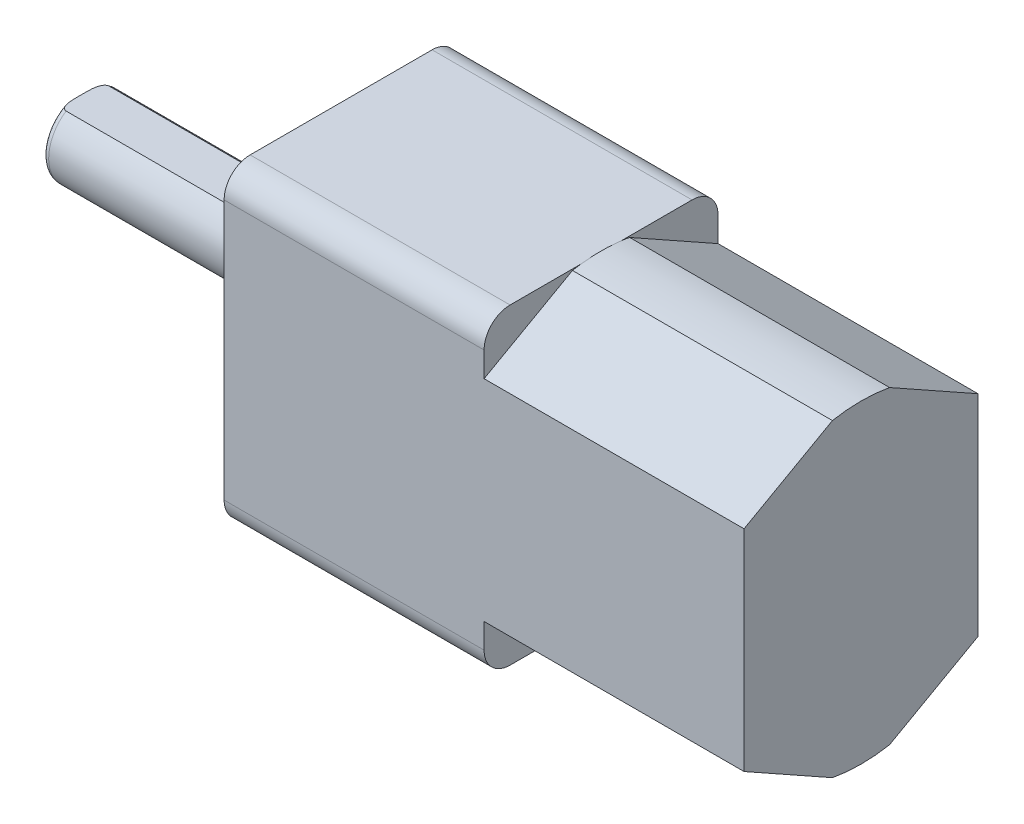
ISO-10303-21;
HEADER;
FILE_DESCRIPTION(('STEP AP214'),'2;1');
FILE_NAME('part.step','',(''),(''),'','','');
FILE_SCHEMA(('AUTOMOTIVE_DESIGN { 1 0 10303 214 1 1 1 1 }'));
ENDSEC;
DATA;
#1=APPLICATION_CONTEXT('core data for automotive mechanical design processes');
#2=APPLICATION_PROTOCOL_DEFINITION('international standard','automotive_design',2000,#1);
#3=PRODUCT_CONTEXT('',#1,'mechanical');
#4=PRODUCT('Part','Part','',(#3));
#5=PRODUCT_RELATED_PRODUCT_CATEGORY('part','',(#4));
#6=PRODUCT_DEFINITION_FORMATION('','',#4);
#7=PRODUCT_DEFINITION_CONTEXT('part definition',#1,'design');
#8=PRODUCT_DEFINITION('design','',#6,#7);
#9=PRODUCT_DEFINITION_SHAPE('','',#8);
#10=(LENGTH_UNIT() NAMED_UNIT(*) SI_UNIT(.MILLI.,.METRE.));
#11=(NAMED_UNIT(*) PLANE_ANGLE_UNIT() SI_UNIT($,.RADIAN.));
#12=(NAMED_UNIT(*) SI_UNIT($,.STERADIAN.) SOLID_ANGLE_UNIT());
#13=UNCERTAINTY_MEASURE_WITH_UNIT(LENGTH_MEASURE(1.E-05),#10,'distance_accuracy_value','');
#14=(GEOMETRIC_REPRESENTATION_CONTEXT(3) GLOBAL_UNCERTAINTY_ASSIGNED_CONTEXT((#13)) GLOBAL_UNIT_ASSIGNED_CONTEXT((#10,
#11,#12)) REPRESENTATION_CONTEXT('',''));
#15=CARTESIAN_POINT('',(0.,0.,0.));
#16=DIRECTION('',(0.,0.,1.));
#17=DIRECTION('',(1.,0.,0.));
#18=AXIS2_PLACEMENT_3D('',#15,#16,#17);
#19=CARTESIAN_POINT('',(-5.7,0.,0.));
#20=DIRECTION('',(-1.,0.,0.));
#21=DIRECTION('',(0.,0.,1.));
#22=AXIS2_PLACEMENT_3D('',#19,#20,#21);
#23=PLANE('',#22);
#24=CARTESIAN_POINT('',(-5.7,0.,-4.5));
#25=DIRECTION('',(-1.,0.,0.));
#26=DIRECTION('',(0.,0.,1.));
#27=AXIS2_PLACEMENT_3D('',#24,#25,#26);
#28=CIRCLE('',#27,2.);
#29=CARTESIAN_POINT('',(-5.7,0.,-2.5));
#30=VERTEX_POINT('',#29);
#31=EDGE_CURVE('E550',#30,#30,#28,.T.);
#32=ORIENTED_EDGE('',*,*,#31,.T.);
#33=EDGE_LOOP('',(#32));
#34=FACE_BOUND('',#33,.T.);
#35=DIRECTION('',(0.,0.,-1.));
#36=VECTOR('',#35,1.);
#37=CARTESIAN_POINT('',(-5.7,1.25,0.));
#38=LINE('',#37,#36);
#39=CARTESIAN_POINT('',(-5.7,1.25,-3.67084380241115));
#40=VERTEX_POINT('',#39);
#41=CARTESIAN_POINT('',(-5.7,1.25,-5.32915619758885));
#42=VERTEX_POINT('',#41);
#43=EDGE_CURVE('E274',#40,#42,#38,.T.);
#44=ORIENTED_EDGE('',*,*,#43,.F.);
#45=CARTESIAN_POINT('',(-5.7,0.,-4.5));
#46=DIRECTION('',(-1.,0.,0.));
#47=DIRECTION('',(0.,0.,1.));
#48=AXIS2_PLACEMENT_3D('',#45,#46,#47);
#49=CIRCLE('',#48,1.5);
#50=EDGE_CURVE('E279',#40,#42,#49,.F.);
#51=ORIENTED_EDGE('',*,*,#50,.T.);
#52=EDGE_LOOP('',(#44,#51));
#53=FACE_BOUND('',#52,.T.);
#54=ADVANCED_FACE('F133',(#34,#53),#23,.T.);
#55=CARTESIAN_POINT('',(5.,0.,-9.));
#56=DIRECTION('',(1.,0.,0.));
#57=DIRECTION('',(0.,0.,-1.));
#58=AXIS2_PLACEMENT_3D('',#55,#56,#57);
#59=PLANE('',#58);
#60=DIRECTION('',(0.,0.,1.));
#61=VECTOR('',#60,1.);
#62=CARTESIAN_POINT('',(5.,-6.,-9.));
#63=LINE('',#62,#61);
#64=CARTESIAN_POINT('',(5.,-6.,-8.));
#65=VERTEX_POINT('',#64);
#66=CARTESIAN_POINT('',(5.,-6.,-5.276208734813));
#67=VERTEX_POINT('',#66);
#68=EDGE_CURVE('E471',#65,#67,#63,.T.);
#69=ORIENTED_EDGE('',*,*,#68,.F.);
#70=CARTESIAN_POINT('',(5.,-5.,-8.));
#71=DIRECTION('',(1.,0.,0.));
#72=DIRECTION('',(0.,0.,-1.));
#73=AXIS2_PLACEMENT_3D('',#70,#71,#72);
#74=CIRCLE('',#73,1.);
#75=CARTESIAN_POINT('',(5.,-5.,-9.));
#76=VERTEX_POINT('',#75);
#77=EDGE_CURVE('E318',#65,#76,#74,.T.);
#78=ORIENTED_EDGE('',*,*,#77,.T.);
#79=DIRECTION('',(0.,1.,0.));
#80=VECTOR('',#79,1.);
#81=CARTESIAN_POINT('',(5.,0.,-9.));
#82=LINE('',#81,#80);
#83=CARTESIAN_POINT('',(5.,-4.04382244911915,-9.));
#84=VERTEX_POINT('',#83);
#85=EDGE_CURVE('E465',#76,#84,#82,.T.);
#86=ORIENTED_EDGE('',*,*,#85,.T.);
#87=DIRECTION('',(0.,-0.488864524341019,0.872359717571157));
#88=VECTOR('',#87,1.);
#89=CARTESIAN_POINT('',(5.,-6.91558675954847,-3.87544835421627));
#90=LINE('',#89,#88);
#91=CARTESIAN_POINT('',(5.,-5.94915960451558,-5.6));
#92=VERTEX_POINT('',#91);
#93=EDGE_CURVE('E521',#84,#92,#90,.T.);
#94=ORIENTED_EDGE('',*,*,#93,.T.);
#95=CARTESIAN_POINT('',(5.,0.,-4.5));
#96=DIRECTION('',(1.,0.,0.));
#97=DIRECTION('',(0.,0.,-1.));
#98=AXIS2_PLACEMENT_3D('',#95,#96,#97);
#99=CIRCLE('',#98,6.05);
#100=EDGE_CURVE('E512',#67,#92,#99,.T.);
#101=ORIENTED_EDGE('',*,*,#100,.F.);
#102=EDGE_LOOP('',(#69,#78,#86,#94,#101));
#103=FACE_BOUND('',#102,.T.);
#104=ADVANCED_FACE('F365',(#103),#59,.T.);
#105=DIRECTION('',(0.,1.,0.));
#106=VECTOR('',#105,1.);
#107=CARTESIAN_POINT('',(5.,0.,0.));
#108=LINE('',#107,#106);
#109=CARTESIAN_POINT('',(5.,-5.,0.));
#110=VERTEX_POINT('',#109);
#111=CARTESIAN_POINT('',(5.,-4.04382244911915,0.));
#112=VERTEX_POINT('',#111);
#113=EDGE_CURVE('E476',#110,#112,#108,.T.);
#114=ORIENTED_EDGE('',*,*,#113,.F.);
#115=CARTESIAN_POINT('',(5.,-5.,-1.));
#116=DIRECTION('',(1.,0.,0.));
#117=DIRECTION('',(0.,0.,-1.));
#118=AXIS2_PLACEMENT_3D('',#115,#116,#117);
#119=CIRCLE('',#118,1.);
#120=CARTESIAN_POINT('',(5.,-6.,-0.999999999999999));
#121=VERTEX_POINT('',#120);
#122=EDGE_CURVE('E296',#110,#121,#119,.T.);
#123=ORIENTED_EDGE('',*,*,#122,.T.);
#124=CARTESIAN_POINT('',(5.,-6.,-3.72379126518699));
#125=VERTEX_POINT('',#124);
#126=EDGE_CURVE('E464',#125,#121,#63,.T.);
#127=ORIENTED_EDGE('',*,*,#126,.F.);
#128=CARTESIAN_POINT('',(5.,-5.94915960451558,-3.4));
#129=VERTEX_POINT('',#128);
#130=EDGE_CURVE('E509',#129,#125,#99,.T.);
#131=ORIENTED_EDGE('',*,*,#130,.F.);
#132=DIRECTION('',(0.,-0.488864524341019,-0.872359717571157));
#133=VECTOR('',#132,1.);
#134=CARTESIAN_POINT('',(5.,-3.07739529408627,1.72455164578373));
#135=LINE('',#134,#133);
#136=EDGE_CURVE('E510',#112,#129,#135,.T.);
#137=ORIENTED_EDGE('',*,*,#136,.F.);
#138=EDGE_LOOP('',(#114,#123,#127,#131,#137));
#139=FACE_BOUND('',#138,.T.);
#140=ADVANCED_FACE('F687',(#139),#59,.T.);
#141=DIRECTION('',(0.,0.,1.));
#142=VECTOR('',#141,1.);
#143=CARTESIAN_POINT('',(5.,6.,-9.));
#144=LINE('',#143,#142);
#145=CARTESIAN_POINT('',(5.,6.,-3.72379126518699));
#146=VERTEX_POINT('',#145);
#147=CARTESIAN_POINT('',(5.,6.,-0.999999999999999));
#148=VERTEX_POINT('',#147);
#149=EDGE_CURVE('E493',#146,#148,#144,.T.);
#150=ORIENTED_EDGE('',*,*,#149,.T.);
#151=CARTESIAN_POINT('',(5.,5.,-0.999999999999999));
#152=DIRECTION('',(1.,0.,0.));
#153=DIRECTION('',(0.,0.,-1.));
#154=AXIS2_PLACEMENT_3D('',#151,#152,#153);
#155=CIRCLE('',#154,1.);
#156=CARTESIAN_POINT('',(5.,5.,0.));
#157=VERTEX_POINT('',#156);
#158=EDGE_CURVE('E335',#148,#157,#155,.T.);
#159=ORIENTED_EDGE('',*,*,#158,.T.);
#160=CARTESIAN_POINT('',(5.,4.04382244911915,0.));
#161=VERTEX_POINT('',#160);
#162=EDGE_CURVE('E480',#161,#157,#108,.T.);
#163=ORIENTED_EDGE('',*,*,#162,.F.);
#164=DIRECTION('',(0.,0.488864524341019,-0.872359717571157));
#165=VECTOR('',#164,1.);
#166=CARTESIAN_POINT('',(5.,3.07739529408627,1.72455164578373));
#167=LINE('',#166,#165);
#168=CARTESIAN_POINT('',(5.,5.94915960451558,-3.4));
#169=VERTEX_POINT('',#168);
#170=EDGE_CURVE('E544',#161,#169,#167,.T.);
#171=ORIENTED_EDGE('',*,*,#170,.T.);
#172=CARTESIAN_POINT('',(5.,0.,-4.5));
#173=DIRECTION('',(1.,0.,0.));
#174=DIRECTION('',(0.,0.,-1.));
#175=AXIS2_PLACEMENT_3D('',#172,#173,#174);
#176=CIRCLE('',#175,6.05);
#177=EDGE_CURVE('E487',#146,#169,#176,.T.);
#178=ORIENTED_EDGE('',*,*,#177,.F.);
#179=EDGE_LOOP('',(#150,#159,#163,#171,#178));
#180=FACE_BOUND('',#179,.T.);
#181=ADVANCED_FACE('F407',(#180),#59,.T.);
#182=CARTESIAN_POINT('',(0.,0.,-9.));
#183=DIRECTION('',(0.,0.,1.));
#184=DIRECTION('',(1.,0.,0.));
#185=AXIS2_PLACEMENT_3D('',#182,#183,#184);
#186=PLANE('',#185);
#187=ORIENTED_EDGE('',*,*,#85,.F.);
#188=DIRECTION('',(1.,0.,0.));
#189=VECTOR('',#188,1.);
#190=CARTESIAN_POINT('',(-5.,-5.,-9.));
#191=LINE('',#190,#189);
#192=CARTESIAN_POINT('',(-5.,-5.,-9.));
#193=VERTEX_POINT('',#192);
#194=EDGE_CURVE('E325',#76,#193,#191,.F.);
#195=ORIENTED_EDGE('',*,*,#194,.T.);
#196=DIRECTION('',(0.,1.,0.));
#197=VECTOR('',#196,1.);
#198=CARTESIAN_POINT('',(-5.,0.,-9.));
#199=LINE('',#198,#197);
#200=CARTESIAN_POINT('',(-5.,5.,-9.));
#201=VERTEX_POINT('',#200);
#202=EDGE_CURVE('E455',#193,#201,#199,.T.);
#203=ORIENTED_EDGE('',*,*,#202,.T.);
#204=DIRECTION('',(1.,0.,0.));
#205=VECTOR('',#204,1.);
#206=CARTESIAN_POINT('',(0.,5.,-9.));
#207=LINE('',#206,#205);
#208=CARTESIAN_POINT('',(5.,5.,-9.));
#209=VERTEX_POINT('',#208);
#210=EDGE_CURVE('E321',#201,#209,#207,.T.);
#211=ORIENTED_EDGE('',*,*,#210,.T.);
#212=CARTESIAN_POINT('',(5.,4.04382244911915,-9.));
#213=VERTEX_POINT('',#212);
#214=EDGE_CURVE('E472',#213,#209,#82,.T.);
#215=ORIENTED_EDGE('',*,*,#214,.F.);
#216=DIRECTION('',(-1.,0.,0.));
#217=VECTOR('',#216,1.);
#218=CARTESIAN_POINT('',(15.,4.04382244911915,-9.));
#219=LINE('',#218,#217);
#220=CARTESIAN_POINT('',(15.,4.04382244911915,-9.));
#221=VERTEX_POINT('',#220);
#222=EDGE_CURVE('E560',#221,#213,#219,.T.);
#223=ORIENTED_EDGE('',*,*,#222,.F.);
#224=DIRECTION('',(0.,1.,0.));
#225=VECTOR('',#224,1.);
#226=CARTESIAN_POINT('',(15.,0.,-9.));
#227=LINE('',#226,#225);
#228=CARTESIAN_POINT('',(15.,-4.04382244911915,-9.));
#229=VERTEX_POINT('',#228);
#230=EDGE_CURVE('E557',#229,#221,#227,.T.);
#231=ORIENTED_EDGE('',*,*,#230,.F.);
#232=DIRECTION('',(-1.,0.,0.));
#233=VECTOR('',#232,1.);
#234=CARTESIAN_POINT('',(15.,-4.04382244911915,-9.));
#235=LINE('',#234,#233);
#236=EDGE_CURVE('E612',#229,#84,#235,.T.);
#237=ORIENTED_EDGE('',*,*,#236,.T.);
#238=EDGE_LOOP('',(#187,#195,#203,#211,#215,#223,#231,#237));
#239=FACE_BOUND('',#238,.T.);
#240=ADVANCED_FACE('F403',(#239),#186,.F.);
#241=CARTESIAN_POINT('',(0.,0.,0.));
#242=DIRECTION('',(0.,0.,1.));
#243=DIRECTION('',(1.,0.,0.));
#244=AXIS2_PLACEMENT_3D('',#241,#242,#243);
#245=PLANE('',#244);
#246=DIRECTION('',(0.,1.,0.));
#247=VECTOR('',#246,1.);
#248=CARTESIAN_POINT('',(-5.,0.,0.));
#249=LINE('',#248,#247);
#250=CARTESIAN_POINT('',(-5.,-5.,0.));
#251=VERTEX_POINT('',#250);
#252=CARTESIAN_POINT('',(-5.,5.,0.));
#253=VERTEX_POINT('',#252);
#254=EDGE_CURVE('E479',#251,#253,#249,.T.);
#255=ORIENTED_EDGE('',*,*,#254,.F.);
#256=DIRECTION('',(1.,0.,0.));
#257=VECTOR('',#256,1.);
#258=CARTESIAN_POINT('',(0.,-5.,0.));
#259=LINE('',#258,#257);
#260=EDGE_CURVE('E289',#251,#110,#259,.T.);
#261=ORIENTED_EDGE('',*,*,#260,.T.);
#262=ORIENTED_EDGE('',*,*,#113,.T.);
#263=DIRECTION('',(-1.,0.,0.));
#264=VECTOR('',#263,1.);
#265=CARTESIAN_POINT('',(15.,-4.04382244911915,0.));
#266=LINE('',#265,#264);
#267=CARTESIAN_POINT('',(15.,-4.04382244911915,0.));
#268=VERTEX_POINT('',#267);
#269=EDGE_CURVE('E603',#268,#112,#266,.T.);
#270=ORIENTED_EDGE('',*,*,#269,.F.);
#271=DIRECTION('',(0.,-1.,0.));
#272=VECTOR('',#271,1.);
#273=CARTESIAN_POINT('',(15.,0.,0.));
#274=LINE('',#273,#272);
#275=CARTESIAN_POINT('',(15.,4.04382244911915,0.));
#276=VERTEX_POINT('',#275);
#277=EDGE_CURVE('E571',#276,#268,#274,.T.);
#278=ORIENTED_EDGE('',*,*,#277,.F.);
#279=DIRECTION('',(-1.,0.,0.));
#280=VECTOR('',#279,1.);
#281=CARTESIAN_POINT('',(15.,4.04382244911915,0.));
#282=LINE('',#281,#280);
#283=EDGE_CURVE('E597',#276,#161,#282,.T.);
#284=ORIENTED_EDGE('',*,*,#283,.T.);
#285=ORIENTED_EDGE('',*,*,#162,.T.);
#286=DIRECTION('',(1.,0.,0.));
#287=VECTOR('',#286,1.);
#288=CARTESIAN_POINT('',(-5.,5.,0.));
#289=LINE('',#288,#287);
#290=EDGE_CURVE('E286',#157,#253,#289,.F.);
#291=ORIENTED_EDGE('',*,*,#290,.T.);
#292=EDGE_LOOP('',(#255,#261,#262,#270,#278,#284,#285,#291));
#293=FACE_BOUND('',#292,.T.);
#294=ADVANCED_FACE('F406',(#293),#245,.T.);
#295=CARTESIAN_POINT('',(-5.,0.,-9.));
#296=DIRECTION('',(1.,0.,0.));
#297=DIRECTION('',(0.,0.,-1.));
#298=AXIS2_PLACEMENT_3D('',#295,#296,#297);
#299=PLANE('',#298);
#300=CARTESIAN_POINT('',(-5.,0.,-4.5));
#301=DIRECTION('',(-1.,0.,0.));
#302=DIRECTION('',(0.,0.,1.));
#303=AXIS2_PLACEMENT_3D('',#300,#301,#302);
#304=CIRCLE('',#303,2.);
#305=CARTESIAN_POINT('',(-5.,0.,-2.5));
#306=VERTEX_POINT('',#305);
#307=EDGE_CURVE('E283',#306,#306,#304,.T.);
#308=ORIENTED_EDGE('',*,*,#307,.F.);
#309=EDGE_LOOP('',(#308));
#310=FACE_BOUND('',#309,.T.);
#311=DIRECTION('',(0.,0.,1.));
#312=VECTOR('',#311,1.);
#313=CARTESIAN_POINT('',(-5.,-6.,-9.));
#314=LINE('',#313,#312);
#315=CARTESIAN_POINT('',(-5.,-6.,-8.));
#316=VERTEX_POINT('',#315);
#317=CARTESIAN_POINT('',(-5.,-6.,-0.999999999999999));
#318=VERTEX_POINT('',#317);
#319=EDGE_CURVE('E484',#316,#318,#314,.T.);
#320=ORIENTED_EDGE('',*,*,#319,.T.);
#321=CARTESIAN_POINT('',(-5.,-5.,-1.));
#322=DIRECTION('',(1.,0.,0.));
#323=DIRECTION('',(0.,0.,-1.));
#324=AXIS2_PLACEMENT_3D('',#321,#322,#323);
#325=CIRCLE('',#324,1.);
#326=EDGE_CURVE('E315',#318,#251,#325,.F.);
#327=ORIENTED_EDGE('',*,*,#326,.T.);
#328=ORIENTED_EDGE('',*,*,#254,.T.);
#329=CARTESIAN_POINT('',(-5.,5.,-0.999999999999999));
#330=DIRECTION('',(1.,0.,0.));
#331=DIRECTION('',(0.,0.,-1.));
#332=AXIS2_PLACEMENT_3D('',#329,#330,#331);
#333=CIRCLE('',#332,1.);
#334=CARTESIAN_POINT('',(-5.,6.,-0.999999999999999));
#335=VERTEX_POINT('',#334);
#336=EDGE_CURVE('E309',#253,#335,#333,.F.);
#337=ORIENTED_EDGE('',*,*,#336,.T.);
#338=DIRECTION('',(0.,0.,1.));
#339=VECTOR('',#338,1.);
#340=CARTESIAN_POINT('',(-5.,6.,-9.));
#341=LINE('',#340,#339);
#342=CARTESIAN_POINT('',(-5.,6.,-8.));
#343=VERTEX_POINT('',#342);
#344=EDGE_CURVE('E458',#343,#335,#341,.T.);
#345=ORIENTED_EDGE('',*,*,#344,.F.);
#346=CARTESIAN_POINT('',(-5.,5.,-8.));
#347=DIRECTION('',(1.,0.,0.));
#348=DIRECTION('',(0.,0.,-1.));
#349=AXIS2_PLACEMENT_3D('',#346,#347,#348);
#350=CIRCLE('',#349,1.);
#351=EDGE_CURVE('E306',#343,#201,#350,.F.);
#352=ORIENTED_EDGE('',*,*,#351,.T.);
#353=ORIENTED_EDGE('',*,*,#202,.F.);
#354=CARTESIAN_POINT('',(-5.,-5.,-8.));
#355=DIRECTION('',(1.,0.,0.));
#356=DIRECTION('',(0.,0.,-1.));
#357=AXIS2_PLACEMENT_3D('',#354,#355,#356);
#358=CIRCLE('',#357,1.);
#359=EDGE_CURVE('E312',#193,#316,#358,.F.);
#360=ORIENTED_EDGE('',*,*,#359,.T.);
#361=EDGE_LOOP('',(#320,#327,#328,#337,#345,#352,#353,#360));
#362=FACE_BOUND('',#361,.T.);
#363=ADVANCED_FACE('F412',(#310,#362),#299,.F.);
#364=CARTESIAN_POINT('',(0.,6.,-9.));
#365=DIRECTION('',(0.,-1.,0.));
#366=DIRECTION('',(0.,0.,-1.));
#367=AXIS2_PLACEMENT_3D('',#364,#365,#366);
#368=PLANE('',#367);
#369=ORIENTED_EDGE('',*,*,#344,.T.);
#370=DIRECTION('',(1.,0.,0.));
#371=VECTOR('',#370,1.);
#372=CARTESIAN_POINT('',(5.,6.,-0.999999999999999));
#373=LINE('',#372,#371);
#374=EDGE_CURVE('E331',#335,#148,#373,.T.);
#375=ORIENTED_EDGE('',*,*,#374,.T.);
#376=ORIENTED_EDGE('',*,*,#149,.F.);
#377=CARTESIAN_POINT('',(5.,6.,-5.276208734813));
#378=VERTEX_POINT('',#377);
#379=EDGE_CURVE('E492',#378,#146,#144,.T.);
#380=ORIENTED_EDGE('',*,*,#379,.F.);
#381=CARTESIAN_POINT('',(5.,6.,-8.));
#382=VERTEX_POINT('',#381);
#383=EDGE_CURVE('E490',#382,#378,#144,.T.);
#384=ORIENTED_EDGE('',*,*,#383,.F.);
#385=DIRECTION('',(1.,0.,0.));
#386=VECTOR('',#385,1.);
#387=CARTESIAN_POINT('',(0.,6.,-8.));
#388=LINE('',#387,#386);
#389=EDGE_CURVE('E328',#382,#343,#388,.F.);
#390=ORIENTED_EDGE('',*,*,#389,.T.);
#391=EDGE_LOOP('',(#369,#375,#376,#380,#384,#390));
#392=FACE_BOUND('',#391,.T.);
#393=ADVANCED_FACE('F416',(#392),#368,.F.);
#394=ORIENTED_EDGE('',*,*,#214,.T.);
#395=CARTESIAN_POINT('',(5.,5.,-8.));
#396=DIRECTION('',(1.,0.,0.));
#397=DIRECTION('',(0.,0.,-1.));
#398=AXIS2_PLACEMENT_3D('',#395,#396,#397);
#399=CIRCLE('',#398,1.);
#400=EDGE_CURVE('E338',#209,#382,#399,.T.);
#401=ORIENTED_EDGE('',*,*,#400,.T.);
#402=ORIENTED_EDGE('',*,*,#383,.T.);
#403=CARTESIAN_POINT('',(5.,5.94915960451558,-5.6));
#404=VERTEX_POINT('',#403);
#405=EDGE_CURVE('E535',#404,#378,#176,.T.);
#406=ORIENTED_EDGE('',*,*,#405,.F.);
#407=DIRECTION('',(0.,0.488864524341019,0.872359717571157));
#408=VECTOR('',#407,1.);
#409=CARTESIAN_POINT('',(5.,6.91558675954847,-3.87544835421627));
#410=LINE('',#409,#408);
#411=EDGE_CURVE('E546',#213,#404,#410,.T.);
#412=ORIENTED_EDGE('',*,*,#411,.F.);
#413=EDGE_LOOP('',(#394,#401,#402,#406,#412));
#414=FACE_BOUND('',#413,.T.);
#415=ADVANCED_FACE('F420',(#414),#59,.T.);
#416=CARTESIAN_POINT('',(0.,-6.,-9.));
#417=DIRECTION('',(0.,-1.,0.));
#418=DIRECTION('',(0.,0.,-1.));
#419=AXIS2_PLACEMENT_3D('',#416,#417,#418);
#420=PLANE('',#419);
#421=ORIENTED_EDGE('',*,*,#126,.T.);
#422=DIRECTION('',(1.,0.,0.));
#423=VECTOR('',#422,1.);
#424=CARTESIAN_POINT('',(0.,-6.,-0.999999999999999));
#425=LINE('',#424,#423);
#426=EDGE_CURVE('E303',#121,#318,#425,.F.);
#427=ORIENTED_EDGE('',*,*,#426,.T.);
#428=ORIENTED_EDGE('',*,*,#319,.F.);
#429=DIRECTION('',(1.,0.,0.));
#430=VECTOR('',#429,1.);
#431=CARTESIAN_POINT('',(5.,-6.,-8.));
#432=LINE('',#431,#430);
#433=EDGE_CURVE('E299',#316,#65,#432,.T.);
#434=ORIENTED_EDGE('',*,*,#433,.T.);
#435=ORIENTED_EDGE('',*,*,#68,.T.);
#436=EDGE_CURVE('E470',#67,#125,#63,.T.);
#437=ORIENTED_EDGE('',*,*,#436,.T.);
#438=EDGE_LOOP('',(#421,#427,#428,#434,#435,#437));
#439=FACE_BOUND('',#438,.T.);
#440=ADVANCED_FACE('F409',(#439),#420,.T.);
#441=CARTESIAN_POINT('',(5.,0.,0.));
#442=DIRECTION('',(1.,0.,0.));
#443=DIRECTION('',(0.,0.,-1.));
#444=AXIS2_PLACEMENT_3D('',#441,#442,#443);
#445=PLANE('',#444);
#446=EDGE_CURVE('E536',#378,#146,#176,.T.);
#447=ORIENTED_EDGE('',*,*,#446,.F.);
#448=ORIENTED_EDGE('',*,*,#379,.T.);
#449=EDGE_LOOP('',(#447,#448));
#450=FACE_BOUND('',#449,.T.);
#451=ADVANCED_FACE('F379',(#450),#445,.F.);
#452=CARTESIAN_POINT('',(15.,6.91558675954847,-3.87544835421627));
#453=DIRECTION('',(0.,-0.872359717571157,0.488864524341019));
#454=DIRECTION('',(0.,-0.488864524341019,-0.872359717571157));
#455=AXIS2_PLACEMENT_3D('',#452,#453,#454);
#456=PLANE('',#455);
#457=ORIENTED_EDGE('',*,*,#411,.T.);
#458=DIRECTION('',(-1.,0.,0.));
#459=VECTOR('',#458,1.);
#460=CARTESIAN_POINT('',(15.,5.94915960451558,-5.6));
#461=LINE('',#460,#459);
#462=CARTESIAN_POINT('',(15.,5.94915960451558,-5.6));
#463=VERTEX_POINT('',#462);
#464=EDGE_CURVE('E591',#463,#404,#461,.T.);
#465=ORIENTED_EDGE('',*,*,#464,.F.);
#466=DIRECTION('',(0.,0.488864524341019,0.872359717571157));
#467=VECTOR('',#466,1.);
#468=CARTESIAN_POINT('',(15.,6.91558675954847,-3.87544835421627));
#469=LINE('',#468,#467);
#470=EDGE_CURVE('E523',#221,#463,#469,.T.);
#471=ORIENTED_EDGE('',*,*,#470,.F.);
#472=ORIENTED_EDGE('',*,*,#222,.T.);
#473=EDGE_LOOP('',(#457,#465,#471,#472));
#474=FACE_BOUND('',#473,.T.);
#475=ADVANCED_FACE('F398',(#474),#456,.F.);
#476=CARTESIAN_POINT('',(15.,0.,-4.5));
#477=DIRECTION('',(-1.,0.,0.));
#478=DIRECTION('',(0.,0.,1.));
#479=AXIS2_PLACEMENT_3D('',#476,#477,#478);
#480=CYLINDRICAL_SURFACE('',#479,6.05);
#481=ORIENTED_EDGE('',*,*,#405,.T.);
#482=ORIENTED_EDGE('',*,*,#446,.T.);
#483=ORIENTED_EDGE('',*,*,#177,.T.);
#484=DIRECTION('',(-1.,0.,0.));
#485=VECTOR('',#484,1.);
#486=CARTESIAN_POINT('',(15.,5.94915960451558,-3.4));
#487=LINE('',#486,#485);
#488=CARTESIAN_POINT('',(15.,5.94915960451558,-3.4));
#489=VERTEX_POINT('',#488);
#490=EDGE_CURVE('E593',#489,#169,#487,.T.);
#491=ORIENTED_EDGE('',*,*,#490,.F.);
#492=CARTESIAN_POINT('',(15.,0.,-4.5));
#493=DIRECTION('',(1.,0.,0.));
#494=DIRECTION('',(0.,0.,-1.));
#495=AXIS2_PLACEMENT_3D('',#492,#493,#494);
#496=CIRCLE('',#495,6.05);
#497=EDGE_CURVE('E578',#463,#489,#496,.T.);
#498=ORIENTED_EDGE('',*,*,#497,.F.);
#499=ORIENTED_EDGE('',*,*,#464,.T.);
#500=EDGE_LOOP('',(#481,#482,#483,#491,#498,#499));
#501=FACE_BOUND('',#500,.T.);
#502=ADVANCED_FACE('F394',(#501),#480,.T.);
#503=CARTESIAN_POINT('',(15.,3.07739529408627,1.72455164578373));
#504=DIRECTION('',(0.,0.872359717571157,0.488864524341019));
#505=DIRECTION('',(0.,-0.488864524341019,0.872359717571157));
#506=AXIS2_PLACEMENT_3D('',#503,#504,#505);
#507=PLANE('',#506);
#508=ORIENTED_EDGE('',*,*,#170,.F.);
#509=ORIENTED_EDGE('',*,*,#283,.F.);
#510=DIRECTION('',(0.,0.488864524341019,-0.872359717571157));
#511=VECTOR('',#510,1.);
#512=CARTESIAN_POINT('',(15.,3.07739529408627,1.72455164578373));
#513=LINE('',#512,#511);
#514=EDGE_CURVE('E574',#276,#489,#513,.T.);
#515=ORIENTED_EDGE('',*,*,#514,.T.);
#516=ORIENTED_EDGE('',*,*,#490,.T.);
#517=EDGE_LOOP('',(#508,#509,#515,#516));
#518=FACE_BOUND('',#517,.T.);
#519=ADVANCED_FACE('F390',(#518),#507,.T.);
#520=CARTESIAN_POINT('',(15.,-3.07739529408627,1.72455164578373));
#521=DIRECTION('',(0.,0.872359717571157,-0.488864524341019));
#522=DIRECTION('',(0.,0.488864524341019,0.872359717571157));
#523=AXIS2_PLACEMENT_3D('',#520,#521,#522);
#524=PLANE('',#523);
#525=ORIENTED_EDGE('',*,*,#136,.T.);
#526=DIRECTION('',(-1.,0.,0.));
#527=VECTOR('',#526,1.);
#528=CARTESIAN_POINT('',(15.,-5.94915960451558,-3.4));
#529=LINE('',#528,#527);
#530=CARTESIAN_POINT('',(15.,-5.94915960451558,-3.4));
#531=VERTEX_POINT('',#530);
#532=EDGE_CURVE('E516',#531,#129,#529,.T.);
#533=ORIENTED_EDGE('',*,*,#532,.F.);
#534=DIRECTION('',(0.,-0.488864524341019,-0.872359717571157));
#535=VECTOR('',#534,1.);
#536=CARTESIAN_POINT('',(15.,-3.07739529408627,1.72455164578373));
#537=LINE('',#536,#535);
#538=EDGE_CURVE('E568',#268,#531,#537,.T.);
#539=ORIENTED_EDGE('',*,*,#538,.F.);
#540=ORIENTED_EDGE('',*,*,#269,.T.);
#541=EDGE_LOOP('',(#525,#533,#539,#540));
#542=FACE_BOUND('',#541,.T.);
#543=ADVANCED_FACE('F386',(#542),#524,.F.);
#544=CARTESIAN_POINT('',(15.,0.,-4.5));
#545=DIRECTION('',(-1.,0.,0.));
#546=DIRECTION('',(0.,0.,1.));
#547=AXIS2_PLACEMENT_3D('',#544,#545,#546);
#548=CYLINDRICAL_SURFACE('',#547,6.05);
#549=ORIENTED_EDGE('',*,*,#130,.T.);
#550=EDGE_CURVE('E505',#125,#67,#99,.T.);
#551=ORIENTED_EDGE('',*,*,#550,.T.);
#552=ORIENTED_EDGE('',*,*,#100,.T.);
#553=DIRECTION('',(-1.,0.,0.));
#554=VECTOR('',#553,1.);
#555=CARTESIAN_POINT('',(15.,-5.94915960451558,-5.6));
#556=LINE('',#555,#554);
#557=CARTESIAN_POINT('',(15.,-5.94915960451558,-5.6));
#558=VERTEX_POINT('',#557);
#559=EDGE_CURVE('E609',#558,#92,#556,.T.);
#560=ORIENTED_EDGE('',*,*,#559,.F.);
#561=CARTESIAN_POINT('',(15.,0.,-4.5));
#562=DIRECTION('',(1.,0.,0.));
#563=DIRECTION('',(0.,0.,-1.));
#564=AXIS2_PLACEMENT_3D('',#561,#562,#563);
#565=CIRCLE('',#564,6.05);
#566=EDGE_CURVE('E565',#531,#558,#565,.T.);
#567=ORIENTED_EDGE('',*,*,#566,.F.);
#568=ORIENTED_EDGE('',*,*,#532,.T.);
#569=EDGE_LOOP('',(#549,#551,#552,#560,#567,#568));
#570=FACE_BOUND('',#569,.T.);
#571=ADVANCED_FACE('F382',(#570),#548,.T.);
#572=CARTESIAN_POINT('',(15.,-6.91558675954847,-3.87544835421627));
#573=DIRECTION('',(0.,-0.872359717571157,-0.488864524341019));
#574=DIRECTION('',(0.,0.488864524341019,-0.872359717571157));
#575=AXIS2_PLACEMENT_3D('',#572,#573,#574);
#576=PLANE('',#575);
#577=ORIENTED_EDGE('',*,*,#93,.F.);
#578=ORIENTED_EDGE('',*,*,#236,.F.);
#579=DIRECTION('',(0.,-0.488864524341019,0.872359717571157));
#580=VECTOR('',#579,1.);
#581=CARTESIAN_POINT('',(15.,-6.91558675954847,-3.87544835421627));
#582=LINE('',#581,#580);
#583=EDGE_CURVE('E561',#229,#558,#582,.T.);
#584=ORIENTED_EDGE('',*,*,#583,.T.);
#585=ORIENTED_EDGE('',*,*,#559,.T.);
#586=EDGE_LOOP('',(#577,#578,#584,#585));
#587=FACE_BOUND('',#586,.T.);
#588=ADVANCED_FACE('F374',(#587),#576,.T.);
#589=CARTESIAN_POINT('',(15.,0.,0.));
#590=DIRECTION('',(1.,0.,0.));
#591=DIRECTION('',(0.,0.,-1.));
#592=AXIS2_PLACEMENT_3D('',#589,#590,#591);
#593=PLANE('',#592);
#594=ORIENTED_EDGE('',*,*,#470,.T.);
#595=ORIENTED_EDGE('',*,*,#497,.T.);
#596=ORIENTED_EDGE('',*,*,#514,.F.);
#597=ORIENTED_EDGE('',*,*,#277,.T.);
#598=ORIENTED_EDGE('',*,*,#538,.T.);
#599=ORIENTED_EDGE('',*,*,#566,.T.);
#600=ORIENTED_EDGE('',*,*,#583,.F.);
#601=ORIENTED_EDGE('',*,*,#230,.T.);
#602=EDGE_LOOP('',(#594,#595,#596,#597,#598,#599,#600,#601));
#603=FACE_BOUND('',#602,.T.);
#604=ADVANCED_FACE('F371',(#603),#593,.T.);
#605=ORIENTED_EDGE('',*,*,#436,.F.);
#606=ORIENTED_EDGE('',*,*,#550,.F.);
#607=EDGE_LOOP('',(#605,#606));
#608=FACE_BOUND('',#607,.T.);
#609=ADVANCED_FACE('F369',(#608),#445,.F.);
#610=CARTESIAN_POINT('',(-5.7,0.,-4.5));
#611=DIRECTION('',(1.,0.,0.));
#612=DIRECTION('',(0.,0.,-1.));
#613=AXIS2_PLACEMENT_3D('',#610,#611,#612);
#614=CYLINDRICAL_SURFACE('',#613,2.);
#615=ORIENTED_EDGE('',*,*,#31,.F.);
#616=EDGE_LOOP('',(#615));
#617=FACE_BOUND('',#616,.T.);
#618=ORIENTED_EDGE('',*,*,#307,.T.);
#619=EDGE_LOOP('',(#618));
#620=FACE_BOUND('',#619,.T.);
#621=ADVANCED_FACE('F360',(#617,#620),#614,.T.);
#622=CARTESIAN_POINT('',(-15.,1.25,0.));
#623=DIRECTION('',(0.,1.,0.));
#624=DIRECTION('',(0.,0.,1.));
#625=AXIS2_PLACEMENT_3D('',#622,#623,#624);
#626=PLANE('',#625);
#627=CARTESIAN_POINT('',(-14.75,1.25,-5.32915619758885));
#628=CARTESIAN_POINT('',(-14.7596433366982,1.25,-5.32918709236908));
#629=CARTESIAN_POINT('',(-14.7692478581666,1.25,-5.32814918851524));
#630=CARTESIAN_POINT('',(-14.7879535648102,1.25,-5.32421715427064));
#631=CARTESIAN_POINT('',(-14.7970594430965,1.25,-5.32134569833998));
#632=CARTESIAN_POINT('',(-14.8145503213928,1.25,-5.31403307006382));
#633=CARTESIAN_POINT('',(-14.822938477043,1.25,-5.3095992601121));
#634=CARTESIAN_POINT('',(-14.8389441304105,1.25,-5.29948049809106));
#635=CARTESIAN_POINT('',(-14.8465590519994,1.25,-5.29379155199354));
#636=CARTESIAN_POINT('',(-14.8646483489298,1.25,-5.27831300983731));
#637=CARTESIAN_POINT('',(-14.8745976950261,1.25,-5.26791271781308));
#638=CARTESIAN_POINT('',(-14.8927624752052,1.25,-5.24572239830638));
#639=CARTESIAN_POINT('',(-14.9009755170147,1.25,-5.23393048784447));
#640=CARTESIAN_POINT('',(-14.9213097391138,1.25,-5.2006167504134));
#641=CARTESIAN_POINT('',(-14.9319770347159,1.25,-5.17821156782147));
#642=CARTESIAN_POINT('',(-14.945541414269,1.25,-5.14360881857848));
#643=CARTESIAN_POINT('',(-14.9496720147304,1.25,-5.13184394984244));
#644=CARTESIAN_POINT('',(-14.9572099813348,1.25,-5.10808980020108));
#645=CARTESIAN_POINT('',(-14.9606178859442,1.25,-5.09610069367039));
#646=CARTESIAN_POINT('',(-14.9700621852701,1.25,-5.05934876065435));
#647=CARTESIAN_POINT('',(-14.9751211492598,1.25,-5.03433714307363));
#648=CARTESIAN_POINT('',(-14.9833774861358,1.25,-4.98400104713085));
#649=CARTESIAN_POINT('',(-14.986572678626,1.25,-4.95867623758346));
#650=CARTESIAN_POINT('',(-14.994229162381,1.25,-4.88221735901996));
#651=CARTESIAN_POINT('',(-14.9967003533156,1.25,-4.83089594799673));
#652=CARTESIAN_POINT('',(-14.9987175671065,1.25,-4.7561348170834));
#653=CARTESIAN_POINT('',(-14.9991233459018,1.25,-4.73268946639696));
#654=CARTESIAN_POINT('',(-14.9996653238665,1.25,-4.68579026978208));
#655=CARTESIAN_POINT('',(-14.9998014964344,1.25,-4.66233642324369));
#656=CARTESIAN_POINT('',(-14.9999607578727,1.25,-4.61573355490873));
#657=CARTESIAN_POINT('',(-14.9999852899436,1.25,-4.59258452333372));
#658=CARTESIAN_POINT('',(-14.9999998548087,1.25,-4.54629046084944));
#659=CARTESIAN_POINT('',(-14.9999898936084,1.25,-4.52314542994531));
#660=CARTESIAN_POINT('',(-15.,1.25,-4.5));
#661=B_SPLINE_CURVE_WITH_KNOTS('',3,(#627,#628,#629,#630,#631,#632,#633,#634,#635,#636,#637,
#638,#639,#640,#641,#642,#643,#644,#645,#646,#647,#648,#649,#650,#651,#652,#653,#654,#655,#656,
#657,#658,#659,#660),.UNSPECIFIED.,.F.,.F.,(4,2,2,2,2,2,2,2,2,2,2,2,2,2,2,2,4),(0.,
0.0288128393646184,0.0572760914154563,0.0856069692971843,0.114029334979876,0.156962785589862,
0.199955009677986,0.273956417160489,0.311354105719059,0.348723831340593,0.425167244147519,
0.501699908430058,0.655669722740175,0.726022537758848,0.796382293980319,0.865829861819667,
0.935265339253276),.UNSPECIFIED.);
#662=CARTESIAN_POINT('',(-14.75,1.25,-5.32915619758885));
#663=VERTEX_POINT('',#662);
#664=CARTESIAN_POINT('',(-15.,1.25,-4.5));
#665=VERTEX_POINT('',#664);
#666=EDGE_CURVE('E345',#663,#665,#661,.T.);
#667=ORIENTED_EDGE('',*,*,#666,.T.);
#668=CARTESIAN_POINT('',(-15.,1.25,-4.5));
#669=CARTESIAN_POINT('',(-14.9999949551892,1.25,-4.47927575390717));
#670=CARTESIAN_POINT('',(-15.000000638508,1.25,-4.45855183379178));
#671=CARTESIAN_POINT('',(-14.9999898105575,1.25,-4.41710258688176));
#672=CARTESIAN_POINT('',(-14.9999732977672,1.25,-4.39637726008806));
#673=CARTESIAN_POINT('',(-14.9998244927289,1.25,-4.33399845588023));
#674=CARTESIAN_POINT('',(-14.9995921292826,1.25,-4.29234402895187));
#675=CARTESIAN_POINT('',(-14.9979717041872,1.25,-4.20874017867427));
#676=CARTESIAN_POINT('',(-14.9965749767261,1.25,-4.16679088910776));
#677=CARTESIAN_POINT('',(-14.991151105721,1.25,-4.0831080091101));
#678=CARTESIAN_POINT('',(-14.9871304161295,1.25,-4.04137414201265));
#679=CARTESIAN_POINT('',(-14.9776212408629,1.25,-3.98007693519651));
#680=CARTESIAN_POINT('',(-14.9739745458458,1.25,-3.96023728171748));
#681=CARTESIAN_POINT('',(-14.9652106662628,1.25,-3.92080439524249));
#682=CARTESIAN_POINT('',(-14.9600884809224,1.25,-3.90121224085341));
#683=CARTESIAN_POINT('',(-14.9463575629296,1.25,-3.85744178099817));
#684=CARTESIAN_POINT('',(-14.9371831879411,1.25,-3.83343481669702));
#685=CARTESIAN_POINT('',(-14.9147431709326,1.25,-3.7874303702803));
#686=CARTESIAN_POINT('',(-14.9015071167549,1.25,-3.76541980046223));
#687=CARTESIAN_POINT('',(-14.8792109203639,1.25,-3.73757574401128));
#688=CARTESIAN_POINT('',(-14.872397690608,1.25,-3.72994887859566));
#689=CARTESIAN_POINT('',(-14.8578242704811,1.25,-3.71563166832582));
#690=CARTESIAN_POINT('',(-14.8500634545841,1.25,-3.70894194842942));
#691=CARTESIAN_POINT('',(-14.8334899338483,1.25,-3.69676973545864));
#692=CARTESIAN_POINT('',(-14.8246659512607,1.25,-3.69130233447397));
#693=CARTESIAN_POINT('',(-14.8061637461027,1.25,-3.68211095942568));
#694=CARTESIAN_POINT('',(-14.7964886424059,1.25,-3.67838091137504));
#695=CARTESIAN_POINT('',(-14.780595561864,1.25,-3.67411513745271));
#696=CARTESIAN_POINT('',(-14.7745563556292,1.25,-3.67289786426505));
#697=CARTESIAN_POINT('',(-14.7623475351157,1.25,-3.67125813782901));
#698=CARTESIAN_POINT('',(-14.7561775022366,1.25,-3.6708388209328));
#699=CARTESIAN_POINT('',(-14.75,1.25,-3.67084380241115));
#700=B_SPLINE_CURVE_WITH_KNOTS('',3,(#668,#669,#670,#671,#672,#673,#674,#675,#676,#677,#678,
#679,#680,#681,#682,#683,#684,#685,#686,#687,#688,#689,#690,#691,#692,#693,#694,#695,#696,#697,
#698,#699),.UNSPECIFIED.,.F.,.F.,(4,2,2,2,2,2,2,2,2,2,2,2,2,2,2,4),(0.,0.0621720797044045,
0.124348420285364,0.249306755373134,0.37520348674156,0.500791721025098,0.56126675225164,
0.62194920858005,0.698824978679591,0.775153522001677,0.805766664162966,0.836400125220481,
0.867393160661584,0.898277012132705,0.916709914844205,0.935215119287062),.UNSPECIFIED.);
#701=CARTESIAN_POINT('',(-14.75,1.25,-3.67084380241115));
#702=VERTEX_POINT('',#701);
#703=EDGE_CURVE('E143',#665,#702,#700,.T.);
#704=ORIENTED_EDGE('',*,*,#703,.T.);
#705=DIRECTION('',(1.,0.,0.));
#706=VECTOR('',#705,1.);
#707=CARTESIAN_POINT('',(-15.,1.25,-3.67084380241115));
#708=LINE('',#707,#706);
#709=EDGE_CURVE('E270',#702,#40,#708,.T.);
#710=ORIENTED_EDGE('',*,*,#709,.T.);
#711=ORIENTED_EDGE('',*,*,#43,.T.);
#712=DIRECTION('',(1.,0.,0.));
#713=VECTOR('',#712,1.);
#714=CARTESIAN_POINT('',(-15.,1.25,-5.32915619758885));
#715=LINE('',#714,#713);
#716=EDGE_CURVE('E277',#663,#42,#715,.T.);
#717=ORIENTED_EDGE('',*,*,#716,.F.);
#718=EDGE_LOOP('',(#667,#704,#710,#711,#717));
#719=FACE_BOUND('',#718,.T.);
#720=ADVANCED_FACE('F272',(#719),#626,.T.);
#721=CARTESIAN_POINT('',(-15.,0.,-4.5));
#722=DIRECTION('',(1.,0.,0.));
#723=DIRECTION('',(0.,0.,-1.));
#724=AXIS2_PLACEMENT_3D('',#721,#722,#723);
#725=CYLINDRICAL_SURFACE('',#724,1.5);
#726=ORIENTED_EDGE('',*,*,#709,.F.);
#727=CARTESIAN_POINT('',(-14.75,0.,-4.5));
#728=DIRECTION('',(-1.,0.,0.));
#729=DIRECTION('',(0.,0.,1.));
#730=AXIS2_PLACEMENT_3D('',#727,#728,#729);
#731=CIRCLE('',#730,1.5);
#732=EDGE_CURVE('E12',#702,#663,#731,.F.);
#733=ORIENTED_EDGE('',*,*,#732,.T.);
#734=ORIENTED_EDGE('',*,*,#716,.T.);
#735=ORIENTED_EDGE('',*,*,#50,.F.);
#736=EDGE_LOOP('',(#726,#733,#734,#735));
#737=FACE_BOUND('',#736,.T.);
#738=ADVANCED_FACE('F280',(#737),#725,.T.);
#739=CARTESIAN_POINT('',(-15.,0.,0.));
#740=DIRECTION('',(-1.,0.,0.));
#741=DIRECTION('',(0.,0.,1.));
#742=AXIS2_PLACEMENT_3D('',#739,#740,#741);
#743=PLANE('',#742);
#744=CARTESIAN_POINT('',(-15.,0.,-4.5));
#745=DIRECTION('',(-1.,0.,0.));
#746=DIRECTION('',(0.,0.,1.));
#747=AXIS2_PLACEMENT_3D('',#744,#745,#746);
#748=CIRCLE('',#747,1.25);
#749=EDGE_CURVE('E341',#665,#665,#748,.T.);
#750=ORIENTED_EDGE('',*,*,#749,.T.);
#751=EDGE_LOOP('',(#750));
#752=FACE_BOUND('',#751,.T.);
#753=ADVANCED_FACE('F432',(#752),#743,.T.);
#754=CARTESIAN_POINT('',(0.,-5.,-1.));
#755=DIRECTION('',(1.,0.,0.));
#756=DIRECTION('',(0.,0.,-1.));
#757=AXIS2_PLACEMENT_3D('',#754,#755,#756);
#758=CYLINDRICAL_SURFACE('',#757,1.);
#759=ORIENTED_EDGE('',*,*,#326,.F.);
#760=ORIENTED_EDGE('',*,*,#426,.F.);
#761=ORIENTED_EDGE('',*,*,#122,.F.);
#762=ORIENTED_EDGE('',*,*,#260,.F.);
#763=EDGE_LOOP('',(#759,#760,#761,#762));
#764=FACE_BOUND('',#763,.T.);
#765=ADVANCED_FACE('F428',(#764),#758,.T.);
#766=CARTESIAN_POINT('',(0.,-5.,-8.));
#767=DIRECTION('',(-1.,0.,0.));
#768=DIRECTION('',(0.,0.,1.));
#769=AXIS2_PLACEMENT_3D('',#766,#767,#768);
#770=CYLINDRICAL_SURFACE('',#769,1.);
#771=ORIENTED_EDGE('',*,*,#359,.F.);
#772=ORIENTED_EDGE('',*,*,#194,.F.);
#773=ORIENTED_EDGE('',*,*,#77,.F.);
#774=ORIENTED_EDGE('',*,*,#433,.F.);
#775=EDGE_LOOP('',(#771,#772,#773,#774));
#776=FACE_BOUND('',#775,.T.);
#777=ADVANCED_FACE('F431',(#776),#770,.T.);
#778=CARTESIAN_POINT('',(0.,5.,-0.999999999999999));
#779=DIRECTION('',(-1.,0.,0.));
#780=DIRECTION('',(0.,0.,1.));
#781=AXIS2_PLACEMENT_3D('',#778,#779,#780);
#782=CYLINDRICAL_SURFACE('',#781,1.);
#783=ORIENTED_EDGE('',*,*,#336,.F.);
#784=ORIENTED_EDGE('',*,*,#290,.F.);
#785=ORIENTED_EDGE('',*,*,#158,.F.);
#786=ORIENTED_EDGE('',*,*,#374,.F.);
#787=EDGE_LOOP('',(#783,#784,#785,#786));
#788=FACE_BOUND('',#787,.T.);
#789=ADVANCED_FACE('F436',(#788),#782,.T.);
#790=CARTESIAN_POINT('',(0.,5.,-8.));
#791=DIRECTION('',(1.,0.,0.));
#792=DIRECTION('',(0.,0.,-1.));
#793=AXIS2_PLACEMENT_3D('',#790,#791,#792);
#794=CYLINDRICAL_SURFACE('',#793,1.);
#795=ORIENTED_EDGE('',*,*,#351,.F.);
#796=ORIENTED_EDGE('',*,*,#389,.F.);
#797=ORIENTED_EDGE('',*,*,#400,.F.);
#798=ORIENTED_EDGE('',*,*,#210,.F.);
#799=EDGE_LOOP('',(#795,#796,#797,#798));
#800=FACE_BOUND('',#799,.T.);
#801=ADVANCED_FACE('F439',(#800),#794,.T.);
#802=CARTESIAN_POINT('',(-14.75,0.,-4.5));
#803=DIRECTION('',(-1.,0.,0.));
#804=DIRECTION('',(0.,0.,1.));
#805=AXIS2_PLACEMENT_3D('',#802,#803,#804);
#806=TOROIDAL_SURFACE('',#805,1.25,0.25);
#807=ORIENTED_EDGE('',*,*,#666,.F.);
#808=ORIENTED_EDGE('',*,*,#732,.F.);
#809=ORIENTED_EDGE('',*,*,#703,.F.);
#810=ORIENTED_EDGE('',*,*,#749,.F.);
#811=EDGE_LOOP('',(#807,#808,#809,#810));
#812=FACE_BOUND('',#811,.T.);
#813=ADVANCED_FACE('F135',(#812),#806,.T.);
#814=CLOSED_SHELL('',(#54,#104,#140,#181,#240,#294,#363,#393,#415,#440,#451,#475,#502,#519,#543,
#571,#588,#604,#609,#621,#720,#738,#753,#765,#777,#789,#801,#813));
#815=MANIFOLD_SOLID_BREP('B2',#814);
#816=ADVANCED_BREP_SHAPE_REPRESENTATION('',(#18,#815),#14);
#817=SHAPE_DEFINITION_REPRESENTATION(#9,#816);
ENDSEC;
END-ISO-10303-21;
